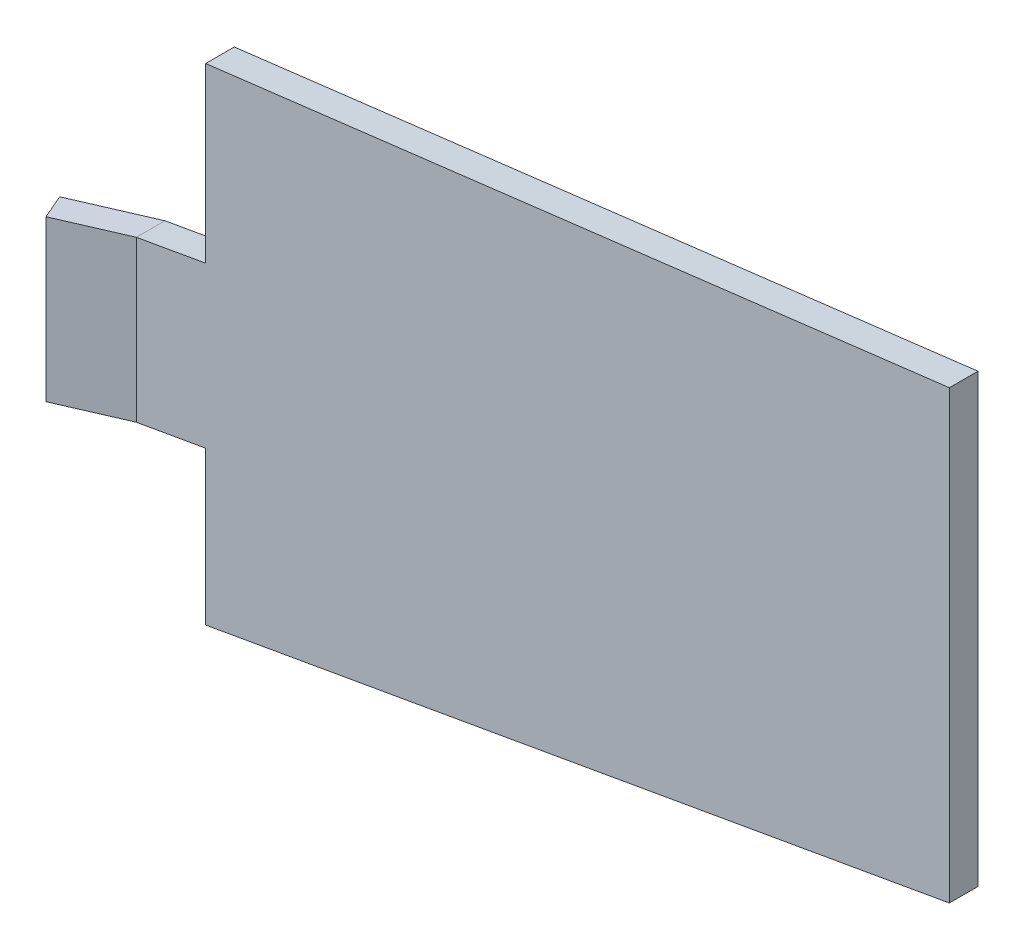
ISO-10303-21;
HEADER;
FILE_DESCRIPTION(('STEP AP214'),'2;1');
FILE_NAME('part.step','',(''),(''),'','','');
FILE_SCHEMA(('AUTOMOTIVE_DESIGN { 1 0 10303 214 1 1 1 1 }'));
ENDSEC;
DATA;
#1=APPLICATION_CONTEXT('core data for automotive mechanical design processes');
#2=APPLICATION_PROTOCOL_DEFINITION('international standard','automotive_design',2000,#1);
#3=PRODUCT_CONTEXT('',#1,'mechanical');
#4=PRODUCT('Part','Part','',(#3));
#5=PRODUCT_RELATED_PRODUCT_CATEGORY('part','',(#4));
#6=PRODUCT_DEFINITION_FORMATION('','',#4);
#7=PRODUCT_DEFINITION_CONTEXT('part definition',#1,'design');
#8=PRODUCT_DEFINITION('design','',#6,#7);
#9=PRODUCT_DEFINITION_SHAPE('','',#8);
#10=(LENGTH_UNIT() NAMED_UNIT(*) SI_UNIT(.MILLI.,.METRE.));
#11=(NAMED_UNIT(*) PLANE_ANGLE_UNIT() SI_UNIT($,.RADIAN.));
#12=(NAMED_UNIT(*) SI_UNIT($,.STERADIAN.) SOLID_ANGLE_UNIT());
#13=UNCERTAINTY_MEASURE_WITH_UNIT(LENGTH_MEASURE(1.E-05),#10,'distance_accuracy_value','');
#14=(GEOMETRIC_REPRESENTATION_CONTEXT(3) GLOBAL_UNCERTAINTY_ASSIGNED_CONTEXT((#13)) GLOBAL_UNIT_ASSIGNED_CONTEXT((#10,
#11,#12)) REPRESENTATION_CONTEXT('',''));
#15=CARTESIAN_POINT('',(0.,0.,0.));
#16=DIRECTION('',(0.,0.,1.));
#17=DIRECTION('',(1.,0.,0.));
#18=AXIS2_PLACEMENT_3D('',#15,#16,#17);
#19=CARTESIAN_POINT('',(0.,85.,5.));
#20=DIRECTION('',(1.,0.,0.));
#21=DIRECTION('',(0.,1.,0.));
#22=AXIS2_PLACEMENT_3D('',#19,#20,#21);
#23=PLANE('',#22);
#24=DIRECTION('',(0.,0.,1.));
#25=VECTOR('',#24,1.);
#26=CARTESIAN_POINT('',(0.,26.7758143591264,0.));
#27=LINE('',#26,#25);
#28=CARTESIAN_POINT('',(0.,26.7758143591264,0.));
#29=VERTEX_POINT('',#28);
#30=CARTESIAN_POINT('',(0.,26.7758143591264,5.));
#31=VERTEX_POINT('',#30);
#32=EDGE_CURVE('E182',#29,#31,#27,.T.);
#33=ORIENTED_EDGE('',*,*,#32,.F.);
#34=DIRECTION('',(0.,-1.,0.));
#35=VECTOR('',#34,1.);
#36=CARTESIAN_POINT('',(0.,85.,0.));
#37=LINE('',#36,#35);
#38=CARTESIAN_POINT('',(0.,0.,0.));
#39=VERTEX_POINT('',#38);
#40=EDGE_CURVE('E204',#29,#39,#37,.T.);
#41=ORIENTED_EDGE('',*,*,#40,.T.);
#42=DIRECTION('',(0.,0.,-1.));
#43=VECTOR('',#42,1.);
#44=CARTESIAN_POINT('',(0.,0.,5.));
#45=LINE('',#44,#43);
#46=CARTESIAN_POINT('',(0.,0.,5.));
#47=VERTEX_POINT('',#46);
#48=EDGE_CURVE('E214',#47,#39,#45,.T.);
#49=ORIENTED_EDGE('',*,*,#48,.F.);
#50=DIRECTION('',(0.,-1.,0.));
#51=VECTOR('',#50,1.);
#52=CARTESIAN_POINT('',(0.,85.,5.));
#53=LINE('',#52,#51);
#54=EDGE_CURVE('E196',#31,#47,#53,.T.);
#55=ORIENTED_EDGE('',*,*,#54,.F.);
#56=EDGE_LOOP('',(#33,#41,#49,#55));
#57=FACE_BOUND('',#56,.T.);
#58=ADVANCED_FACE('F39',(#57),#23,.F.);
#59=CARTESIAN_POINT('',(130.,100.922507492101,5.));
#60=DIRECTION('',(0.12157233447178,-0.992582574646101,0.));
#61=DIRECTION('',(0.992582574646101,0.12157233447178,0.));
#62=AXIS2_PLACEMENT_3D('',#59,#60,#61);
#63=PLANE('',#62);
#64=DIRECTION('',(-0.992582574646101,-0.12157233447178,0.));
#65=VECTOR('',#64,1.);
#66=CARTESIAN_POINT('',(130.,100.922507492101,0.));
#67=LINE('',#66,#65);
#68=CARTESIAN_POINT('',(130.,100.922507492101,0.));
#69=VERTEX_POINT('',#68);
#70=CARTESIAN_POINT('',(0.,85.,0.));
#71=VERTEX_POINT('',#70);
#72=EDGE_CURVE('E190',#69,#71,#67,.T.);
#73=ORIENTED_EDGE('',*,*,#72,.T.);
#74=DIRECTION('',(0.,0.,-1.));
#75=VECTOR('',#74,1.);
#76=CARTESIAN_POINT('',(0.,85.,5.));
#77=LINE('',#76,#75);
#78=CARTESIAN_POINT('',(0.,85.,5.));
#79=VERTEX_POINT('',#78);
#80=EDGE_CURVE('E217',#79,#71,#77,.T.);
#81=ORIENTED_EDGE('',*,*,#80,.F.);
#82=DIRECTION('',(-0.992582574646101,-0.12157233447178,0.));
#83=VECTOR('',#82,1.);
#84=CARTESIAN_POINT('',(130.,100.922507492101,5.));
#85=LINE('',#84,#83);
#86=CARTESIAN_POINT('',(130.,100.922507492101,5.));
#87=VERTEX_POINT('',#86);
#88=EDGE_CURVE('E194',#87,#79,#85,.T.);
#89=ORIENTED_EDGE('',*,*,#88,.F.);
#90=DIRECTION('',(0.,0.,-1.));
#91=VECTOR('',#90,1.);
#92=CARTESIAN_POINT('',(130.,100.922507492101,5.));
#93=LINE('',#92,#91);
#94=EDGE_CURVE('E201',#87,#69,#93,.T.);
#95=ORIENTED_EDGE('',*,*,#94,.T.);
#96=EDGE_LOOP('',(#73,#81,#89,#95));
#97=FACE_BOUND('',#96,.T.);
#98=ADVANCED_FACE('F41',(#97),#63,.F.);
#99=CARTESIAN_POINT('',(0.,54.7758143591264,0.));
#100=VERTEX_POINT('',#99);
#101=EDGE_CURVE('E205',#71,#100,#37,.T.);
#102=ORIENTED_EDGE('',*,*,#101,.T.);
#103=DIRECTION('',(0.,0.,1.));
#104=VECTOR('',#103,1.);
#105=CARTESIAN_POINT('',(0.,54.7758143591264,0.));
#106=LINE('',#105,#104);
#107=CARTESIAN_POINT('',(0.,54.7758143591264,5.));
#108=VERTEX_POINT('',#107);
#109=EDGE_CURVE('E191',#100,#108,#106,.T.);
#110=ORIENTED_EDGE('',*,*,#109,.T.);
#111=EDGE_CURVE('E91',#79,#108,#53,.T.);
#112=ORIENTED_EDGE('',*,*,#111,.F.);
#113=ORIENTED_EDGE('',*,*,#80,.T.);
#114=EDGE_LOOP('',(#102,#110,#112,#113));
#115=FACE_BOUND('',#114,.T.);
#116=ADVANCED_FACE('F239',(#115),#23,.F.);
#117=CARTESIAN_POINT('',(0.,0.,5.));
#118=DIRECTION('',(-0.173648177666934,0.984807753012207,0.));
#119=DIRECTION('',(-0.984807753012207,-0.173648177666934,0.));
#120=AXIS2_PLACEMENT_3D('',#117,#118,#119);
#121=PLANE('',#120);
#122=DIRECTION('',(0.984807753012207,0.173648177666934,0.));
#123=VECTOR('',#122,1.);
#124=CARTESIAN_POINT('',(0.,0.,0.));
#125=LINE('',#124,#123);
#126=CARTESIAN_POINT('',(130.,22.9225074921009,0.));
#127=VERTEX_POINT('',#126);
#128=EDGE_CURVE('E208',#39,#127,#125,.T.);
#129=ORIENTED_EDGE('',*,*,#128,.T.);
#130=DIRECTION('',(0.,0.,-1.));
#131=VECTOR('',#130,1.);
#132=CARTESIAN_POINT('',(130.,22.9225074921009,5.));
#133=LINE('',#132,#131);
#134=CARTESIAN_POINT('',(130.,22.9225074921009,5.));
#135=VERTEX_POINT('',#134);
#136=EDGE_CURVE('E212',#135,#127,#133,.T.);
#137=ORIENTED_EDGE('',*,*,#136,.F.);
#138=DIRECTION('',(0.984807753012207,0.173648177666934,0.));
#139=VECTOR('',#138,1.);
#140=CARTESIAN_POINT('',(0.,0.,5.));
#141=LINE('',#140,#139);
#142=EDGE_CURVE('E198',#47,#135,#141,.T.);
#143=ORIENTED_EDGE('',*,*,#142,.F.);
#144=ORIENTED_EDGE('',*,*,#48,.T.);
#145=EDGE_LOOP('',(#129,#137,#143,#144));
#146=FACE_BOUND('',#145,.T.);
#147=ADVANCED_FACE('F263',(#146),#121,.F.);
#148=CARTESIAN_POINT('',(130.,22.9225074921009,5.));
#149=DIRECTION('',(-1.,0.,0.));
#150=DIRECTION('',(0.,-1.,0.));
#151=AXIS2_PLACEMENT_3D('',#148,#149,#150);
#152=PLANE('',#151);
#153=DIRECTION('',(0.,1.,0.));
#154=VECTOR('',#153,1.);
#155=CARTESIAN_POINT('',(130.,22.9225074921009,0.));
#156=LINE('',#155,#154);
#157=EDGE_CURVE('E84',#127,#69,#156,.T.);
#158=ORIENTED_EDGE('',*,*,#157,.T.);
#159=ORIENTED_EDGE('',*,*,#94,.F.);
#160=DIRECTION('',(0.,1.,0.));
#161=VECTOR('',#160,1.);
#162=CARTESIAN_POINT('',(130.,22.9225074921009,5.));
#163=LINE('',#162,#161);
#164=EDGE_CURVE('E63',#135,#87,#163,.T.);
#165=ORIENTED_EDGE('',*,*,#164,.F.);
#166=ORIENTED_EDGE('',*,*,#136,.T.);
#167=EDGE_LOOP('',(#158,#159,#165,#166));
#168=FACE_BOUND('',#167,.T.);
#169=ADVANCED_FACE('F268',(#168),#152,.F.);
#170=CARTESIAN_POINT('',(0.,0.,5.));
#171=DIRECTION('',(0.,0.,1.));
#172=DIRECTION('',(1.,0.,0.));
#173=AXIS2_PLACEMENT_3D('',#170,#171,#172);
#174=PLANE('',#173);
#175=ORIENTED_EDGE('',*,*,#88,.T.);
#176=ORIENTED_EDGE('',*,*,#111,.T.);
#177=DIRECTION('',(-0.984807753012207,-0.173648177666934,0.));
#178=VECTOR('',#177,1.);
#179=CARTESIAN_POINT('',(-12.1131353620502,52.6399417738231,5.));
#180=LINE('',#179,#178);
#181=CARTESIAN_POINT('',(-12.1131353620502,52.6399417738231,5.));
#182=VERTEX_POINT('',#181);
#183=EDGE_CURVE('E54',#108,#182,#180,.T.);
#184=ORIENTED_EDGE('',*,*,#183,.T.);
#185=DIRECTION('',(0.,-1.,0.));
#186=VECTOR('',#185,1.);
#187=CARTESIAN_POINT('',(-12.1131353620502,24.6399417738231,5.));
#188=LINE('',#187,#186);
#189=CARTESIAN_POINT('',(-12.1131353620502,24.6399417738231,5.));
#190=VERTEX_POINT('',#189);
#191=EDGE_CURVE('E169',#182,#190,#188,.T.);
#192=ORIENTED_EDGE('',*,*,#191,.T.);
#193=DIRECTION('',(0.984807753012207,0.173648177666936,0.));
#194=VECTOR('',#193,1.);
#195=CARTESIAN_POINT('',(0.,26.7758143591264,5.));
#196=LINE('',#195,#194);
#197=EDGE_CURVE('E185',#190,#31,#196,.T.);
#198=ORIENTED_EDGE('',*,*,#197,.T.);
#199=ORIENTED_EDGE('',*,*,#54,.T.);
#200=ORIENTED_EDGE('',*,*,#142,.T.);
#201=ORIENTED_EDGE('',*,*,#164,.T.);
#202=EDGE_LOOP('',(#175,#176,#184,#192,#198,#199,#200,#201));
#203=FACE_BOUND('',#202,.T.);
#204=ADVANCED_FACE('F233',(#203),#174,.T.);
#205=CARTESIAN_POINT('',(0.,0.,0.));
#206=DIRECTION('',(0.,0.,1.));
#207=DIRECTION('',(1.,0.,0.));
#208=AXIS2_PLACEMENT_3D('',#205,#206,#207);
#209=PLANE('',#208);
#210=ORIENTED_EDGE('',*,*,#72,.F.);
#211=ORIENTED_EDGE('',*,*,#157,.F.);
#212=ORIENTED_EDGE('',*,*,#128,.F.);
#213=ORIENTED_EDGE('',*,*,#40,.F.);
#214=DIRECTION('',(0.984807753012207,0.173648177666936,0.));
#215=VECTOR('',#214,1.);
#216=CARTESIAN_POINT('',(0.,26.7758143591264,0.));
#217=LINE('',#216,#215);
#218=CARTESIAN_POINT('',(-12.1131353620502,24.6399417738231,0.));
#219=VERTEX_POINT('',#218);
#220=EDGE_CURVE('E177',#219,#29,#217,.T.);
#221=ORIENTED_EDGE('',*,*,#220,.F.);
#222=DIRECTION('',(0.,-1.,0.));
#223=VECTOR('',#222,1.);
#224=CARTESIAN_POINT('',(-12.1131353620502,24.6399417738231,0.));
#225=LINE('',#224,#223);
#226=CARTESIAN_POINT('',(-12.1131353620502,52.6399417738231,0.));
#227=VERTEX_POINT('',#226);
#228=EDGE_CURVE('E175',#227,#219,#225,.T.);
#229=ORIENTED_EDGE('',*,*,#228,.F.);
#230=DIRECTION('',(-0.984807753012207,-0.173648177666934,0.));
#231=VECTOR('',#230,1.);
#232=CARTESIAN_POINT('',(-12.1131353620502,52.6399417738231,0.));
#233=LINE('',#232,#231);
#234=EDGE_CURVE('E179',#100,#227,#233,.T.);
#235=ORIENTED_EDGE('',*,*,#234,.F.);
#236=ORIENTED_EDGE('',*,*,#101,.F.);
#237=EDGE_LOOP('',(#210,#211,#212,#213,#221,#229,#235,#236));
#238=FACE_BOUND('',#237,.T.);
#239=ADVANCED_FACE('F242',(#238),#209,.F.);
#240=CARTESIAN_POINT('',(-12.1131353620502,52.6399417738231,0.));
#241=DIRECTION('',(-0.173648177666934,0.984807753012207,0.));
#242=DIRECTION('',(-0.984807753012207,-0.173648177666934,0.));
#243=AXIS2_PLACEMENT_3D('',#240,#241,#242);
#244=PLANE('',#243);
#245=ORIENTED_EDGE('',*,*,#183,.F.);
#246=ORIENTED_EDGE('',*,*,#109,.F.);
#247=ORIENTED_EDGE('',*,*,#234,.T.);
#248=DIRECTION('',(0.,0.,1.));
#249=VECTOR('',#248,1.);
#250=CARTESIAN_POINT('',(-12.1131353620502,52.6399417738231,0.));
#251=LINE('',#250,#249);
#252=EDGE_CURVE('E139',#227,#182,#251,.T.);
#253=ORIENTED_EDGE('',*,*,#252,.T.);
#254=EDGE_LOOP('',(#245,#246,#247,#253));
#255=FACE_BOUND('',#254,.T.);
#256=ADVANCED_FACE('F243',(#255),#244,.T.);
#257=CARTESIAN_POINT('',(0.,26.7758143591264,0.));
#258=DIRECTION('',(0.173648177666936,-0.984807753012207,0.));
#259=DIRECTION('',(0.984807753012207,0.173648177666936,0.));
#260=AXIS2_PLACEMENT_3D('',#257,#258,#259);
#261=PLANE('',#260);
#262=DIRECTION('',(-0.905300693341904,-0.159628937890263,0.39363594452577));
#263=VECTOR('',#262,1.);
#264=CARTESIAN_POINT('',(-0.0951268546250299,26.7590409280661,-0.225578821414197));
#265=LINE('',#264,#263);
#266=CARTESIAN_POINT('',(-10.2847511080023,24.9623352489143,4.20499590015626));
#267=VERTEX_POINT('',#266);
#268=EDGE_CURVE('E11',#267,#190,#265,.T.);
#269=ORIENTED_EDGE('',*,*,#268,.F.);
#270=DIRECTION('',(0.397767094856302,0.0701370708611917,0.91480168864109));
#271=VECTOR('',#270,1.);
#272=CARTESIAN_POINT('',(-10.1370242544987,24.9883834789621,4.544744403213));
#273=LINE('',#272,#271);
#274=EDGE_CURVE('E47',#219,#267,#273,.T.);
#275=ORIENTED_EDGE('',*,*,#274,.F.);
#276=ORIENTED_EDGE('',*,*,#220,.T.);
#277=ORIENTED_EDGE('',*,*,#32,.T.);
#278=ORIENTED_EDGE('',*,*,#197,.F.);
#279=EDGE_LOOP('',(#269,#275,#276,#277,#278));
#280=FACE_BOUND('',#279,.T.);
#281=ADVANCED_FACE('F245',(#280),#261,.T.);
#282=CARTESIAN_POINT('',(-10.2847511080023,52.6399417738231,4.20499590015626));
#283=DIRECTION('',(0.398749068925244,0.,0.917060074385125));
#284=DIRECTION('',(0.917060074385125,0.,-0.398749068925244));
#285=AXIS2_PLACEMENT_3D('',#282,#283,#284);
#286=PLANE('',#285);
#287=DIRECTION('',(-0.917060074385125,0.,0.398749068925244));
#288=VECTOR('',#287,1.);
#289=CARTESIAN_POINT('',(-10.2847511080023,24.6399417738231,4.20499590015626));
#290=LINE('',#289,#288);
#291=CARTESIAN_POINT('',(-23.1178562546717,24.6399417738231,9.78498882710293));
#292=VERTEX_POINT('',#291);
#293=EDGE_CURVE('E173',#190,#292,#290,.T.);
#294=ORIENTED_EDGE('',*,*,#293,.F.);
#295=ORIENTED_EDGE('',*,*,#191,.F.);
#296=DIRECTION('',(-0.917060074385125,0.,0.398749068925244));
#297=VECTOR('',#296,1.);
#298=CARTESIAN_POINT('',(-10.2847511080023,52.6399417738231,4.20499590015626));
#299=LINE('',#298,#297);
#300=CARTESIAN_POINT('',(-23.1178562546717,52.6399417738231,9.78498882710293));
#301=VERTEX_POINT('',#300);
#302=EDGE_CURVE('E167',#182,#301,#299,.T.);
#303=ORIENTED_EDGE('',*,*,#302,.T.);
#304=DIRECTION('',(0.,1.,0.));
#305=VECTOR('',#304,1.);
#306=CARTESIAN_POINT('',(-23.1178562546717,52.6399417738231,9.78498882710293));
#307=LINE('',#306,#305);
#308=EDGE_CURVE('E157',#292,#301,#307,.T.);
#309=ORIENTED_EDGE('',*,*,#308,.F.);
#310=EDGE_LOOP('',(#294,#295,#303,#309));
#311=FACE_BOUND('',#310,.T.);
#312=ADVANCED_FACE('F231',(#311),#286,.T.);
#313=CARTESIAN_POINT('',(-10.2847511080023,24.6399417738231,4.20499590015626));
#314=DIRECTION('',(0.,-1.,0.));
#315=DIRECTION('',(1.,0.,0.));
#316=AXIS2_PLACEMENT_3D('',#313,#314,#315);
#317=PLANE('',#316);
#318=DIRECTION('',(-0.917060074385125,0.,0.398749068925244));
#319=VECTOR('',#318,1.);
#320=CARTESIAN_POINT('',(-12.1131353620502,24.6399417738231,0.));
#321=LINE('',#320,#319);
#322=CARTESIAN_POINT('',(-24.9462405087196,24.6399417738231,5.57999292694667));
#323=VERTEX_POINT('',#322);
#324=EDGE_CURVE('E142',#219,#323,#321,.T.);
#325=ORIENTED_EDGE('',*,*,#324,.F.);
#326=DIRECTION('',(0.398749068925244,0.,0.917060074385125));
#327=VECTOR('',#326,1.);
#328=CARTESIAN_POINT('',(-10.2847511080023,24.6399417738231,4.20499590015626));
#329=LINE('',#328,#327);
#330=CARTESIAN_POINT('',(-10.2847511080023,24.6399417738231,4.20499590015626));
#331=VERTEX_POINT('',#330);
#332=EDGE_CURVE('E162',#219,#331,#329,.T.);
#333=ORIENTED_EDGE('',*,*,#332,.T.);
#334=EDGE_CURVE('E170',#331,#190,#290,.T.);
#335=ORIENTED_EDGE('',*,*,#334,.T.);
#336=ORIENTED_EDGE('',*,*,#293,.T.);
#337=DIRECTION('',(0.398749068925244,0.,0.917060074385125));
#338=VECTOR('',#337,1.);
#339=CARTESIAN_POINT('',(-23.1178562546717,24.6399417738231,9.78498882710293));
#340=LINE('',#339,#338);
#341=EDGE_CURVE('E152',#323,#292,#340,.T.);
#342=ORIENTED_EDGE('',*,*,#341,.F.);
#343=EDGE_LOOP('',(#325,#333,#335,#336,#342));
#344=FACE_BOUND('',#343,.T.);
#345=ADVANCED_FACE('F229',(#344),#317,.T.);
#346=CARTESIAN_POINT('',(-12.1131353620502,52.6399417738231,0.));
#347=DIRECTION('',(0.,1.,0.));
#348=DIRECTION('',(-1.,0.,0.));
#349=AXIS2_PLACEMENT_3D('',#346,#347,#348);
#350=PLANE('',#349);
#351=ORIENTED_EDGE('',*,*,#302,.F.);
#352=ORIENTED_EDGE('',*,*,#252,.F.);
#353=DIRECTION('',(-0.917060074385125,0.,0.398749068925244));
#354=VECTOR('',#353,1.);
#355=CARTESIAN_POINT('',(-12.1131353620502,52.6399417738231,0.));
#356=LINE('',#355,#354);
#357=CARTESIAN_POINT('',(-24.9462405087196,52.6399417738231,5.57999292694667));
#358=VERTEX_POINT('',#357);
#359=EDGE_CURVE('E133',#227,#358,#356,.T.);
#360=ORIENTED_EDGE('',*,*,#359,.T.);
#361=DIRECTION('',(-0.398749068925244,0.,-0.917060074385125));
#362=VECTOR('',#361,1.);
#363=CARTESIAN_POINT('',(-24.9462405087196,52.6399417738231,5.57999292694667));
#364=LINE('',#363,#362);
#365=EDGE_CURVE('E138',#301,#358,#364,.T.);
#366=ORIENTED_EDGE('',*,*,#365,.F.);
#367=EDGE_LOOP('',(#351,#352,#360,#366));
#368=FACE_BOUND('',#367,.T.);
#369=ADVANCED_FACE('F136',(#368),#350,.T.);
#370=DIRECTION('',(0.,1.,0.));
#371=VECTOR('',#370,1.);
#372=CARTESIAN_POINT('',(-10.2847511080023,52.6399417738231,4.20499590015626));
#373=LINE('',#372,#371);
#374=EDGE_CURVE('E143',#331,#267,#373,.T.);
#375=ORIENTED_EDGE('',*,*,#374,.T.);
#376=ORIENTED_EDGE('',*,*,#268,.T.);
#377=ORIENTED_EDGE('',*,*,#334,.F.);
#378=EDGE_LOOP('',(#375,#376,#377));
#379=FACE_BOUND('',#378,.T.);
#380=ADVANCED_FACE('F226',(#379),#286,.T.);
#381=CARTESIAN_POINT('',(-12.1131353620502,24.6399417738231,0.));
#382=DIRECTION('',(-0.398749068925244,0.,-0.917060074385125));
#383=DIRECTION('',(-0.917060074385125,0.,0.398749068925244));
#384=AXIS2_PLACEMENT_3D('',#381,#382,#383);
#385=PLANE('',#384);
#386=ORIENTED_EDGE('',*,*,#324,.T.);
#387=DIRECTION('',(0.,-1.,0.));
#388=VECTOR('',#387,1.);
#389=CARTESIAN_POINT('',(-24.9462405087196,24.6399417738231,5.57999292694667));
#390=LINE('',#389,#388);
#391=EDGE_CURVE('E146',#358,#323,#390,.T.);
#392=ORIENTED_EDGE('',*,*,#391,.F.);
#393=ORIENTED_EDGE('',*,*,#359,.F.);
#394=ORIENTED_EDGE('',*,*,#228,.T.);
#395=EDGE_LOOP('',(#386,#392,#393,#394));
#396=FACE_BOUND('',#395,.T.);
#397=ADVANCED_FACE('F147',(#396),#385,.T.);
#398=CARTESIAN_POINT('',(-10.1871369070918,0.,4.42949319262472));
#399=DIRECTION('',(0.917060074385125,0.,-0.398749068925244));
#400=DIRECTION('',(-0.398749068925244,0.,-0.917060074385125));
#401=AXIS2_PLACEMENT_3D('',#398,#399,#400);
#402=PLANE('',#401);
#403=ORIENTED_EDGE('',*,*,#332,.F.);
#404=ORIENTED_EDGE('',*,*,#274,.T.);
#405=ORIENTED_EDGE('',*,*,#374,.F.);
#406=EDGE_LOOP('',(#403,#404,#405));
#407=FACE_BOUND('',#406,.T.);
#408=ADVANCED_FACE('F222',(#407),#402,.T.);
#409=CARTESIAN_POINT('',(-23.0202420537612,0.,10.0094861195714));
#410=DIRECTION('',(0.917060074385125,0.,-0.398749068925244));
#411=DIRECTION('',(-0.398749068925244,0.,-0.917060074385125));
#412=AXIS2_PLACEMENT_3D('',#409,#410,#411);
#413=PLANE('',#412);
#414=ORIENTED_EDGE('',*,*,#365,.T.);
#415=ORIENTED_EDGE('',*,*,#391,.T.);
#416=ORIENTED_EDGE('',*,*,#341,.T.);
#417=ORIENTED_EDGE('',*,*,#308,.T.);
#418=EDGE_LOOP('',(#414,#415,#416,#417));
#419=FACE_BOUND('',#418,.T.);
#420=ADVANCED_FACE('F155',(#419),#413,.F.);
#421=CLOSED_SHELL('',(#58,#98,#116,#147,#169,#204,#239,#256,#281,#312,#345,#369,#380,#397,#408,#420));
#422=MANIFOLD_SOLID_BREP('B2',#421);
#423=ADVANCED_BREP_SHAPE_REPRESENTATION('',(#18,#422),#14);
#424=SHAPE_DEFINITION_REPRESENTATION(#9,#423);
ENDSEC;
END-ISO-10303-21;
